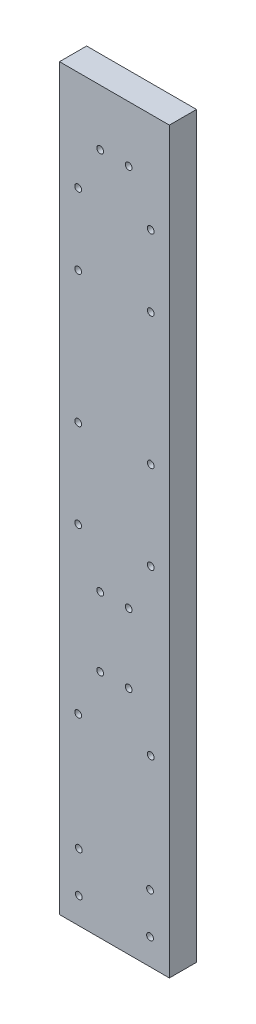
ISO-10303-21;
HEADER;
FILE_DESCRIPTION(('STEP AP214'),'2;1');
FILE_NAME('part.step','',(''),(''),'','','');
FILE_SCHEMA(('AUTOMOTIVE_DESIGN { 1 0 10303 214 1 1 1 1 }'));
ENDSEC;
DATA;
#1=APPLICATION_CONTEXT('core data for automotive mechanical design processes');
#2=APPLICATION_PROTOCOL_DEFINITION('international standard','automotive_design',2000,#1);
#3=PRODUCT_CONTEXT('',#1,'mechanical');
#4=PRODUCT('Part','Part','',(#3));
#5=PRODUCT_RELATED_PRODUCT_CATEGORY('part','',(#4));
#6=PRODUCT_DEFINITION_FORMATION('','',#4);
#7=PRODUCT_DEFINITION_CONTEXT('part definition',#1,'design');
#8=PRODUCT_DEFINITION('design','',#6,#7);
#9=PRODUCT_DEFINITION_SHAPE('','',#8);
#10=(LENGTH_UNIT() NAMED_UNIT(*) SI_UNIT(.MILLI.,.METRE.));
#11=(NAMED_UNIT(*) PLANE_ANGLE_UNIT() SI_UNIT($,.RADIAN.));
#12=(NAMED_UNIT(*) SI_UNIT($,.STERADIAN.) SOLID_ANGLE_UNIT());
#13=UNCERTAINTY_MEASURE_WITH_UNIT(LENGTH_MEASURE(1.E-05),#10,'distance_accuracy_value','');
#14=(GEOMETRIC_REPRESENTATION_CONTEXT(3) GLOBAL_UNCERTAINTY_ASSIGNED_CONTEXT((#13)) GLOBAL_UNIT_ASSIGNED_CONTEXT((#10,
#11,#12)) REPRESENTATION_CONTEXT('',''));
#15=CARTESIAN_POINT('',(0.,0.,0.));
#16=DIRECTION('',(0.,0.,1.));
#17=DIRECTION('',(1.,0.,0.));
#18=AXIS2_PLACEMENT_3D('',#15,#16,#17);
#19=CARTESIAN_POINT('',(0.,0.,4.));
#20=DIRECTION('',(0.,0.,1.));
#21=DIRECTION('',(1.,0.,0.));
#22=AXIS2_PLACEMENT_3D('',#19,#20,#21);
#23=PLANE('',#22);
#24=CARTESIAN_POINT('',(13.350000000001,9.8464488310554,4.));
#25=DIRECTION('',(0.,0.,1.));
#26=DIRECTION('',(-1.,0.,0.));
#27=AXIS2_PLACEMENT_3D('',#24,#25,#26);
#28=CIRCLE('',#27,0.499999999999999);
#29=CARTESIAN_POINT('',(12.850000000001,9.8464488310554,4.));
#30=VERTEX_POINT('',#29);
#31=EDGE_CURVE('E216',#30,#30,#28,.T.);
#32=ORIENTED_EDGE('',*,*,#31,.F.);
#33=EDGE_LOOP('',(#32));
#34=FACE_BOUND('',#33,.T.);
#35=CARTESIAN_POINT('',(2.85000000000001,9.8464488310554,4.));
#36=DIRECTION('',(0.,0.,1.));
#37=DIRECTION('',(1.,0.,0.));
#38=AXIS2_PLACEMENT_3D('',#35,#36,#37);
#39=CIRCLE('',#38,0.499999999999999);
#40=CARTESIAN_POINT('',(3.35,9.8464488310554,4.));
#41=VERTEX_POINT('',#40);
#42=EDGE_CURVE('E204',#41,#41,#39,.T.);
#43=ORIENTED_EDGE('',*,*,#42,.F.);
#44=EDGE_LOOP('',(#43));
#45=FACE_BOUND('',#44,.T.);
#46=CARTESIAN_POINT('',(13.4500000000022,94.1599999999975,4.));
#47=DIRECTION('',(0.,0.,1.));
#48=DIRECTION('',(1.,0.,0.));
#49=AXIS2_PLACEMENT_3D('',#46,#47,#48);
#50=CIRCLE('',#49,0.499999999999999);
#51=CARTESIAN_POINT('',(13.9500000000022,94.1599999999975,4.));
#52=VERTEX_POINT('',#51);
#53=EDGE_CURVE('E192',#52,#52,#50,.T.);
#54=ORIENTED_EDGE('',*,*,#53,.F.);
#55=EDGE_LOOP('',(#54));
#56=FACE_BOUND('',#55,.T.);
#57=CARTESIAN_POINT('',(13.4500000000001,83.6599999999992,4.));
#58=DIRECTION('',(0.,0.,1.));
#59=DIRECTION('',(1.,0.,0.));
#60=AXIS2_PLACEMENT_3D('',#57,#58,#59);
#61=CIRCLE('',#60,0.499999999999999);
#62=CARTESIAN_POINT('',(13.9500000000001,83.6599999999992,4.));
#63=VERTEX_POINT('',#62);
#64=EDGE_CURVE('E180',#63,#63,#61,.T.);
#65=ORIENTED_EDGE('',*,*,#64,.F.);
#66=EDGE_LOOP('',(#65));
#67=FACE_BOUND('',#66,.T.);
#68=CARTESIAN_POINT('',(13.4500000000017,64.209999999999,4.));
#69=DIRECTION('',(0.,0.,1.));
#70=DIRECTION('',(1.,0.,0.));
#71=AXIS2_PLACEMENT_3D('',#68,#69,#70);
#72=CIRCLE('',#71,0.499999999999999);
#73=CARTESIAN_POINT('',(13.9500000000017,64.209999999999,4.));
#74=VERTEX_POINT('',#73);
#75=EDGE_CURVE('E168',#74,#74,#72,.T.);
#76=ORIENTED_EDGE('',*,*,#75,.F.);
#77=EDGE_LOOP('',(#76));
#78=FACE_BOUND('',#77,.T.);
#79=CARTESIAN_POINT('',(13.4500000000001,51.2099999999992,4.));
#80=DIRECTION('',(0.,0.,1.));
#81=DIRECTION('',(1.,0.,0.));
#82=AXIS2_PLACEMENT_3D('',#79,#80,#81);
#83=CIRCLE('',#82,0.499999999999999);
#84=CARTESIAN_POINT('',(13.9500000000001,51.2099999999992,4.));
#85=VERTEX_POINT('',#84);
#86=EDGE_CURVE('E156',#85,#85,#83,.T.);
#87=ORIENTED_EDGE('',*,*,#86,.F.);
#88=EDGE_LOOP('',(#87));
#89=FACE_BOUND('',#88,.T.);
#90=CARTESIAN_POINT('',(13.4500000000001,27.0000000000002,4.));
#91=DIRECTION('',(0.,0.,1.));
#92=DIRECTION('',(1.,0.,0.));
#93=AXIS2_PLACEMENT_3D('',#90,#91,#92);
#94=CIRCLE('',#93,0.499999999999999);
#95=CARTESIAN_POINT('',(13.9500000000001,27.0000000000002,4.));
#96=VERTEX_POINT('',#95);
#97=EDGE_CURVE('E144',#96,#96,#94,.T.);
#98=ORIENTED_EDGE('',*,*,#97,.F.);
#99=EDGE_LOOP('',(#98));
#100=FACE_BOUND('',#99,.T.);
#101=CARTESIAN_POINT('',(10.2000000000001,33.9999999999999,4.));
#102=DIRECTION('',(0.,0.,1.));
#103=DIRECTION('',(1.,0.,0.));
#104=AXIS2_PLACEMENT_3D('',#101,#102,#103);
#105=CIRCLE('',#104,0.499999999999999);
#106=CARTESIAN_POINT('',(10.7000000000001,33.9999999999999,4.));
#107=VERTEX_POINT('',#106);
#108=EDGE_CURVE('E132',#107,#107,#105,.T.);
#109=ORIENTED_EDGE('',*,*,#108,.F.);
#110=EDGE_LOOP('',(#109));
#111=FACE_BOUND('',#110,.T.);
#112=CARTESIAN_POINT('',(10.2000000000001,44.2099999999995,4.));
#113=DIRECTION('',(0.,0.,1.));
#114=DIRECTION('',(1.,0.,0.));
#115=AXIS2_PLACEMENT_3D('',#112,#113,#114);
#116=CIRCLE('',#115,0.499999999999999);
#117=CARTESIAN_POINT('',(10.7000000000001,44.2099999999995,4.));
#118=VERTEX_POINT('',#117);
#119=EDGE_CURVE('E120',#118,#118,#116,.T.);
#120=ORIENTED_EDGE('',*,*,#119,.F.);
#121=EDGE_LOOP('',(#120));
#122=FACE_BOUND('',#121,.T.);
#123=CARTESIAN_POINT('',(10.2000000000012,100.660000000002,4.));
#124=DIRECTION('',(0.,0.,1.));
#125=DIRECTION('',(1.,0.,0.));
#126=AXIS2_PLACEMENT_3D('',#123,#124,#125);
#127=CIRCLE('',#126,0.499999999999999);
#128=CARTESIAN_POINT('',(10.7000000000012,100.660000000002,4.));
#129=VERTEX_POINT('',#128);
#130=EDGE_CURVE('E99',#129,#129,#127,.T.);
#131=ORIENTED_EDGE('',*,*,#130,.F.);
#132=EDGE_LOOP('',(#131));
#133=FACE_BOUND('',#132,.T.);
#134=DIRECTION('',(0.,-1.,0.));
#135=VECTOR('',#134,1.);
#136=CARTESIAN_POINT('',(0.,108.909999999999,4.));
#137=LINE('',#136,#135);
#138=CARTESIAN_POINT('',(0.,108.909999999999,4.));
#139=VERTEX_POINT('',#138);
#140=CARTESIAN_POINT('',(0.,0.,4.));
#141=VERTEX_POINT('',#140);
#142=EDGE_CURVE('E84',#139,#141,#137,.T.);
#143=ORIENTED_EDGE('',*,*,#142,.T.);
#144=DIRECTION('',(1.,0.,0.));
#145=VECTOR('',#144,1.);
#146=CARTESIAN_POINT('',(0.,0.,4.));
#147=LINE('',#146,#145);
#148=CARTESIAN_POINT('',(16.2,0.,4.));
#149=VERTEX_POINT('',#148);
#150=EDGE_CURVE('E79',#141,#149,#147,.T.);
#151=ORIENTED_EDGE('',*,*,#150,.T.);
#152=DIRECTION('',(0.,1.,0.));
#153=VECTOR('',#152,1.);
#154=CARTESIAN_POINT('',(16.2,0.,4.));
#155=LINE('',#154,#153);
#156=CARTESIAN_POINT('',(16.2,108.909999999999,4.));
#157=VERTEX_POINT('',#156);
#158=EDGE_CURVE('E82',#149,#157,#155,.T.);
#159=ORIENTED_EDGE('',*,*,#158,.T.);
#160=DIRECTION('',(-1.,0.,0.));
#161=VECTOR('',#160,1.);
#162=CARTESIAN_POINT('',(16.2,108.909999999999,4.));
#163=LINE('',#162,#161);
#164=EDGE_CURVE('E49',#157,#139,#163,.T.);
#165=ORIENTED_EDGE('',*,*,#164,.T.);
#166=EDGE_LOOP('',(#143,#151,#159,#165));
#167=FACE_BOUND('',#166,.T.);
#168=CARTESIAN_POINT('',(6.00000000000112,100.660000000002,4.));
#169=DIRECTION('',(0.,0.,1.));
#170=DIRECTION('',(1.,0.,0.));
#171=AXIS2_PLACEMENT_3D('',#168,#169,#170);
#172=CIRCLE('',#171,0.499999999999999);
#173=CARTESIAN_POINT('',(6.50000000000111,100.660000000002,4.));
#174=VERTEX_POINT('',#173);
#175=EDGE_CURVE('E114',#174,#174,#172,.T.);
#176=ORIENTED_EDGE('',*,*,#175,.F.);
#177=EDGE_LOOP('',(#176));
#178=FACE_BOUND('',#177,.T.);
#179=CARTESIAN_POINT('',(6.00000000000001,44.2099999999995,4.));
#180=DIRECTION('',(0.,0.,1.));
#181=DIRECTION('',(1.,0.,0.));
#182=AXIS2_PLACEMENT_3D('',#179,#180,#181);
#183=CIRCLE('',#182,0.499999999999999);
#184=CARTESIAN_POINT('',(6.5,44.2099999999995,4.));
#185=VERTEX_POINT('',#184);
#186=EDGE_CURVE('E126',#185,#185,#183,.T.);
#187=ORIENTED_EDGE('',*,*,#186,.F.);
#188=EDGE_LOOP('',(#187));
#189=FACE_BOUND('',#188,.T.);
#190=CARTESIAN_POINT('',(6.00000000000001,33.9999999999999,4.));
#191=DIRECTION('',(0.,0.,1.));
#192=DIRECTION('',(1.,0.,0.));
#193=AXIS2_PLACEMENT_3D('',#190,#191,#192);
#194=CIRCLE('',#193,0.500000000000012);
#195=CARTESIAN_POINT('',(6.50000000000002,33.9999999999999,4.));
#196=VERTEX_POINT('',#195);
#197=EDGE_CURVE('E138',#196,#196,#194,.T.);
#198=ORIENTED_EDGE('',*,*,#197,.F.);
#199=EDGE_LOOP('',(#198));
#200=FACE_BOUND('',#199,.T.);
#201=CARTESIAN_POINT('',(2.75000000000004,27.0000000000004,4.));
#202=DIRECTION('',(0.,0.,1.));
#203=DIRECTION('',(1.,0.,0.));
#204=AXIS2_PLACEMENT_3D('',#201,#202,#203);
#205=CIRCLE('',#204,0.499999999999999);
#206=CARTESIAN_POINT('',(3.25000000000004,27.0000000000004,4.));
#207=VERTEX_POINT('',#206);
#208=EDGE_CURVE('E150',#207,#207,#205,.T.);
#209=ORIENTED_EDGE('',*,*,#208,.F.);
#210=EDGE_LOOP('',(#209));
#211=FACE_BOUND('',#210,.T.);
#212=CARTESIAN_POINT('',(2.75000000000003,51.2099999999994,4.));
#213=DIRECTION('',(0.,0.,1.));
#214=DIRECTION('',(1.,0.,0.));
#215=AXIS2_PLACEMENT_3D('',#212,#213,#214);
#216=CIRCLE('',#215,0.499999999999999);
#217=CARTESIAN_POINT('',(3.25000000000003,51.2099999999994,4.));
#218=VERTEX_POINT('',#217);
#219=EDGE_CURVE('E162',#218,#218,#216,.T.);
#220=ORIENTED_EDGE('',*,*,#219,.F.);
#221=EDGE_LOOP('',(#220));
#222=FACE_BOUND('',#221,.T.);
#223=CARTESIAN_POINT('',(2.75000000000138,64.2099999999993,4.));
#224=DIRECTION('',(0.,0.,1.));
#225=DIRECTION('',(1.,0.,0.));
#226=AXIS2_PLACEMENT_3D('',#223,#224,#225);
#227=CIRCLE('',#226,0.499999999999999);
#228=CARTESIAN_POINT('',(3.25000000000138,64.2099999999993,4.));
#229=VERTEX_POINT('',#228);
#230=EDGE_CURVE('E174',#229,#229,#227,.T.);
#231=ORIENTED_EDGE('',*,*,#230,.F.);
#232=EDGE_LOOP('',(#231));
#233=FACE_BOUND('',#232,.T.);
#234=CARTESIAN_POINT('',(2.75000000000004,83.6599999999994,4.));
#235=DIRECTION('',(0.,0.,1.));
#236=DIRECTION('',(1.,0.,0.));
#237=AXIS2_PLACEMENT_3D('',#234,#235,#236);
#238=CIRCLE('',#237,0.499999999999999);
#239=CARTESIAN_POINT('',(3.25000000000004,83.6599999999994,4.));
#240=VERTEX_POINT('',#239);
#241=EDGE_CURVE('E186',#240,#240,#238,.T.);
#242=ORIENTED_EDGE('',*,*,#241,.F.);
#243=EDGE_LOOP('',(#242));
#244=FACE_BOUND('',#243,.T.);
#245=CARTESIAN_POINT('',(2.75000000000093,94.1599999999998,4.));
#246=DIRECTION('',(0.,0.,1.));
#247=DIRECTION('',(1.,0.,0.));
#248=AXIS2_PLACEMENT_3D('',#245,#246,#247);
#249=CIRCLE('',#248,0.499999999999999);
#250=CARTESIAN_POINT('',(3.25000000000093,94.1599999999998,4.));
#251=VERTEX_POINT('',#250);
#252=EDGE_CURVE('E198',#251,#251,#249,.T.);
#253=ORIENTED_EDGE('',*,*,#252,.F.);
#254=EDGE_LOOP('',(#253));
#255=FACE_BOUND('',#254,.T.);
#256=CARTESIAN_POINT('',(2.85000000000001,3.84644883105539,4.));
#257=DIRECTION('',(0.,0.,1.));
#258=DIRECTION('',(1.,0.,0.));
#259=AXIS2_PLACEMENT_3D('',#256,#257,#258);
#260=CIRCLE('',#259,0.499999999999999);
#261=CARTESIAN_POINT('',(3.35,3.84644883105539,4.));
#262=VERTEX_POINT('',#261);
#263=EDGE_CURVE('E210',#262,#262,#260,.T.);
#264=ORIENTED_EDGE('',*,*,#263,.F.);
#265=EDGE_LOOP('',(#264));
#266=FACE_BOUND('',#265,.T.);
#267=CARTESIAN_POINT('',(13.350000000001,3.84644883105539,4.));
#268=DIRECTION('',(0.,0.,1.));
#269=DIRECTION('',(-1.,0.,0.));
#270=AXIS2_PLACEMENT_3D('',#267,#268,#269);
#271=CIRCLE('',#270,0.499999999999999);
#272=CARTESIAN_POINT('',(12.850000000001,3.84644883105539,4.));
#273=VERTEX_POINT('',#272);
#274=EDGE_CURVE('E222',#273,#273,#271,.T.);
#275=ORIENTED_EDGE('',*,*,#274,.F.);
#276=EDGE_LOOP('',(#275));
#277=FACE_BOUND('',#276,.T.);
#278=ADVANCED_FACE('F32',(#34,#45,#56,#67,#78,#89,#100,#111,#122,#133,#167,#178,#189,#200,#211,
#222,#233,#244,#255,#266,#277),#23,.T.);
#279=CARTESIAN_POINT('',(0.,0.,0.));
#280=DIRECTION('',(0.,0.,1.));
#281=DIRECTION('',(1.,0.,0.));
#282=AXIS2_PLACEMENT_3D('',#279,#280,#281);
#283=PLANE('',#282);
#284=CARTESIAN_POINT('',(13.350000000001,9.8464488310554,0.));
#285=DIRECTION('',(0.,0.,1.));
#286=DIRECTION('',(-1.,0.,0.));
#287=AXIS2_PLACEMENT_3D('',#284,#285,#286);
#288=CIRCLE('',#287,0.499999999999999);
#289=CARTESIAN_POINT('',(12.850000000001,9.8464488310554,0.));
#290=VERTEX_POINT('',#289);
#291=EDGE_CURVE('E219',#290,#290,#288,.T.);
#292=ORIENTED_EDGE('',*,*,#291,.T.);
#293=EDGE_LOOP('',(#292));
#294=FACE_BOUND('',#293,.T.);
#295=CARTESIAN_POINT('',(2.85000000000001,9.8464488310554,0.));
#296=DIRECTION('',(0.,0.,1.));
#297=DIRECTION('',(1.,0.,0.));
#298=AXIS2_PLACEMENT_3D('',#295,#296,#297);
#299=CIRCLE('',#298,0.499999999999999);
#300=CARTESIAN_POINT('',(3.35,9.8464488310554,0.));
#301=VERTEX_POINT('',#300);
#302=EDGE_CURVE('E207',#301,#301,#299,.T.);
#303=ORIENTED_EDGE('',*,*,#302,.T.);
#304=EDGE_LOOP('',(#303));
#305=FACE_BOUND('',#304,.T.);
#306=CARTESIAN_POINT('',(13.4500000000022,94.1599999999975,0.));
#307=DIRECTION('',(0.,0.,1.));
#308=DIRECTION('',(1.,0.,0.));
#309=AXIS2_PLACEMENT_3D('',#306,#307,#308);
#310=CIRCLE('',#309,0.499999999999999);
#311=CARTESIAN_POINT('',(13.9500000000022,94.1599999999975,0.));
#312=VERTEX_POINT('',#311);
#313=EDGE_CURVE('E195',#312,#312,#310,.T.);
#314=ORIENTED_EDGE('',*,*,#313,.T.);
#315=EDGE_LOOP('',(#314));
#316=FACE_BOUND('',#315,.T.);
#317=CARTESIAN_POINT('',(13.4500000000001,83.6599999999992,0.));
#318=DIRECTION('',(0.,0.,1.));
#319=DIRECTION('',(1.,0.,0.));
#320=AXIS2_PLACEMENT_3D('',#317,#318,#319);
#321=CIRCLE('',#320,0.499999999999999);
#322=CARTESIAN_POINT('',(13.9500000000001,83.6599999999992,0.));
#323=VERTEX_POINT('',#322);
#324=EDGE_CURVE('E183',#323,#323,#321,.T.);
#325=ORIENTED_EDGE('',*,*,#324,.T.);
#326=EDGE_LOOP('',(#325));
#327=FACE_BOUND('',#326,.T.);
#328=CARTESIAN_POINT('',(13.4500000000017,64.209999999999,0.));
#329=DIRECTION('',(0.,0.,1.));
#330=DIRECTION('',(1.,0.,0.));
#331=AXIS2_PLACEMENT_3D('',#328,#329,#330);
#332=CIRCLE('',#331,0.499999999999999);
#333=CARTESIAN_POINT('',(13.9500000000017,64.209999999999,0.));
#334=VERTEX_POINT('',#333);
#335=EDGE_CURVE('E171',#334,#334,#332,.T.);
#336=ORIENTED_EDGE('',*,*,#335,.T.);
#337=EDGE_LOOP('',(#336));
#338=FACE_BOUND('',#337,.T.);
#339=CARTESIAN_POINT('',(13.4500000000001,51.2099999999992,0.));
#340=DIRECTION('',(0.,0.,1.));
#341=DIRECTION('',(1.,0.,0.));
#342=AXIS2_PLACEMENT_3D('',#339,#340,#341);
#343=CIRCLE('',#342,0.499999999999999);
#344=CARTESIAN_POINT('',(13.9500000000001,51.2099999999992,0.));
#345=VERTEX_POINT('',#344);
#346=EDGE_CURVE('E159',#345,#345,#343,.T.);
#347=ORIENTED_EDGE('',*,*,#346,.T.);
#348=EDGE_LOOP('',(#347));
#349=FACE_BOUND('',#348,.T.);
#350=CARTESIAN_POINT('',(13.4500000000001,27.0000000000002,0.));
#351=DIRECTION('',(0.,0.,1.));
#352=DIRECTION('',(1.,0.,0.));
#353=AXIS2_PLACEMENT_3D('',#350,#351,#352);
#354=CIRCLE('',#353,0.499999999999999);
#355=CARTESIAN_POINT('',(13.9500000000001,27.0000000000002,0.));
#356=VERTEX_POINT('',#355);
#357=EDGE_CURVE('E147',#356,#356,#354,.T.);
#358=ORIENTED_EDGE('',*,*,#357,.T.);
#359=EDGE_LOOP('',(#358));
#360=FACE_BOUND('',#359,.T.);
#361=CARTESIAN_POINT('',(10.2000000000001,33.9999999999999,0.));
#362=DIRECTION('',(0.,0.,1.));
#363=DIRECTION('',(1.,0.,0.));
#364=AXIS2_PLACEMENT_3D('',#361,#362,#363);
#365=CIRCLE('',#364,0.499999999999999);
#366=CARTESIAN_POINT('',(10.7000000000001,33.9999999999999,0.));
#367=VERTEX_POINT('',#366);
#368=EDGE_CURVE('E135',#367,#367,#365,.T.);
#369=ORIENTED_EDGE('',*,*,#368,.T.);
#370=EDGE_LOOP('',(#369));
#371=FACE_BOUND('',#370,.T.);
#372=CARTESIAN_POINT('',(10.2000000000001,44.2099999999995,0.));
#373=DIRECTION('',(0.,0.,1.));
#374=DIRECTION('',(1.,0.,0.));
#375=AXIS2_PLACEMENT_3D('',#372,#373,#374);
#376=CIRCLE('',#375,0.499999999999999);
#377=CARTESIAN_POINT('',(10.7000000000001,44.2099999999995,0.));
#378=VERTEX_POINT('',#377);
#379=EDGE_CURVE('E123',#378,#378,#376,.T.);
#380=ORIENTED_EDGE('',*,*,#379,.T.);
#381=EDGE_LOOP('',(#380));
#382=FACE_BOUND('',#381,.T.);
#383=CARTESIAN_POINT('',(10.2000000000012,100.660000000002,0.));
#384=DIRECTION('',(0.,0.,1.));
#385=DIRECTION('',(1.,0.,0.));
#386=AXIS2_PLACEMENT_3D('',#383,#384,#385);
#387=CIRCLE('',#386,0.499999999999999);
#388=CARTESIAN_POINT('',(10.7000000000012,100.660000000002,0.));
#389=VERTEX_POINT('',#388);
#390=EDGE_CURVE('E111',#389,#389,#387,.T.);
#391=ORIENTED_EDGE('',*,*,#390,.T.);
#392=EDGE_LOOP('',(#391));
#393=FACE_BOUND('',#392,.T.);
#394=DIRECTION('',(0.,-1.,0.));
#395=VECTOR('',#394,1.);
#396=CARTESIAN_POINT('',(0.,108.909999999999,0.));
#397=LINE('',#396,#395);
#398=CARTESIAN_POINT('',(0.,108.909999999999,0.));
#399=VERTEX_POINT('',#398);
#400=CARTESIAN_POINT('',(0.,0.,0.));
#401=VERTEX_POINT('',#400);
#402=EDGE_CURVE('E96',#399,#401,#397,.T.);
#403=ORIENTED_EDGE('',*,*,#402,.F.);
#404=DIRECTION('',(-1.,0.,0.));
#405=VECTOR('',#404,1.);
#406=CARTESIAN_POINT('',(16.2,108.909999999999,0.));
#407=LINE('',#406,#405);
#408=CARTESIAN_POINT('',(16.2,108.909999999999,0.));
#409=VERTEX_POINT('',#408);
#410=EDGE_CURVE('E72',#409,#399,#407,.T.);
#411=ORIENTED_EDGE('',*,*,#410,.F.);
#412=DIRECTION('',(0.,1.,0.));
#413=VECTOR('',#412,1.);
#414=CARTESIAN_POINT('',(16.2,0.,0.));
#415=LINE('',#414,#413);
#416=CARTESIAN_POINT('',(16.2,0.,0.));
#417=VERTEX_POINT('',#416);
#418=EDGE_CURVE('E66',#417,#409,#415,.T.);
#419=ORIENTED_EDGE('',*,*,#418,.F.);
#420=DIRECTION('',(1.,0.,0.));
#421=VECTOR('',#420,1.);
#422=CARTESIAN_POINT('',(0.,0.,0.));
#423=LINE('',#422,#421);
#424=EDGE_CURVE('E88',#401,#417,#423,.T.);
#425=ORIENTED_EDGE('',*,*,#424,.F.);
#426=EDGE_LOOP('',(#403,#411,#419,#425));
#427=FACE_BOUND('',#426,.T.);
#428=CARTESIAN_POINT('',(6.00000000000112,100.660000000002,0.));
#429=DIRECTION('',(0.,0.,1.));
#430=DIRECTION('',(1.,0.,0.));
#431=AXIS2_PLACEMENT_3D('',#428,#429,#430);
#432=CIRCLE('',#431,0.499999999999999);
#433=CARTESIAN_POINT('',(6.50000000000111,100.660000000002,0.));
#434=VERTEX_POINT('',#433);
#435=EDGE_CURVE('E117',#434,#434,#432,.T.);
#436=ORIENTED_EDGE('',*,*,#435,.T.);
#437=EDGE_LOOP('',(#436));
#438=FACE_BOUND('',#437,.T.);
#439=CARTESIAN_POINT('',(6.00000000000001,44.2099999999995,0.));
#440=DIRECTION('',(0.,0.,1.));
#441=DIRECTION('',(1.,0.,0.));
#442=AXIS2_PLACEMENT_3D('',#439,#440,#441);
#443=CIRCLE('',#442,0.499999999999999);
#444=CARTESIAN_POINT('',(6.5,44.2099999999995,0.));
#445=VERTEX_POINT('',#444);
#446=EDGE_CURVE('E129',#445,#445,#443,.T.);
#447=ORIENTED_EDGE('',*,*,#446,.T.);
#448=EDGE_LOOP('',(#447));
#449=FACE_BOUND('',#448,.T.);
#450=CARTESIAN_POINT('',(6.00000000000001,33.9999999999999,0.));
#451=DIRECTION('',(0.,0.,1.));
#452=DIRECTION('',(1.,0.,0.));
#453=AXIS2_PLACEMENT_3D('',#450,#451,#452);
#454=CIRCLE('',#453,0.500000000000012);
#455=CARTESIAN_POINT('',(6.50000000000002,33.9999999999999,0.));
#456=VERTEX_POINT('',#455);
#457=EDGE_CURVE('E141',#456,#456,#454,.T.);
#458=ORIENTED_EDGE('',*,*,#457,.T.);
#459=EDGE_LOOP('',(#458));
#460=FACE_BOUND('',#459,.T.);
#461=CARTESIAN_POINT('',(2.75000000000004,27.0000000000004,0.));
#462=DIRECTION('',(0.,0.,1.));
#463=DIRECTION('',(1.,0.,0.));
#464=AXIS2_PLACEMENT_3D('',#461,#462,#463);
#465=CIRCLE('',#464,0.499999999999999);
#466=CARTESIAN_POINT('',(3.25000000000004,27.0000000000004,0.));
#467=VERTEX_POINT('',#466);
#468=EDGE_CURVE('E153',#467,#467,#465,.T.);
#469=ORIENTED_EDGE('',*,*,#468,.T.);
#470=EDGE_LOOP('',(#469));
#471=FACE_BOUND('',#470,.T.);
#472=CARTESIAN_POINT('',(2.75000000000003,51.2099999999994,0.));
#473=DIRECTION('',(0.,0.,1.));
#474=DIRECTION('',(1.,0.,0.));
#475=AXIS2_PLACEMENT_3D('',#472,#473,#474);
#476=CIRCLE('',#475,0.499999999999999);
#477=CARTESIAN_POINT('',(3.25000000000003,51.2099999999994,0.));
#478=VERTEX_POINT('',#477);
#479=EDGE_CURVE('E165',#478,#478,#476,.T.);
#480=ORIENTED_EDGE('',*,*,#479,.T.);
#481=EDGE_LOOP('',(#480));
#482=FACE_BOUND('',#481,.T.);
#483=CARTESIAN_POINT('',(2.75000000000138,64.2099999999993,0.));
#484=DIRECTION('',(0.,0.,1.));
#485=DIRECTION('',(1.,0.,0.));
#486=AXIS2_PLACEMENT_3D('',#483,#484,#485);
#487=CIRCLE('',#486,0.499999999999999);
#488=CARTESIAN_POINT('',(3.25000000000138,64.2099999999993,0.));
#489=VERTEX_POINT('',#488);
#490=EDGE_CURVE('E177',#489,#489,#487,.T.);
#491=ORIENTED_EDGE('',*,*,#490,.T.);
#492=EDGE_LOOP('',(#491));
#493=FACE_BOUND('',#492,.T.);
#494=CARTESIAN_POINT('',(2.75000000000004,83.6599999999994,0.));
#495=DIRECTION('',(0.,0.,1.));
#496=DIRECTION('',(1.,0.,0.));
#497=AXIS2_PLACEMENT_3D('',#494,#495,#496);
#498=CIRCLE('',#497,0.499999999999999);
#499=CARTESIAN_POINT('',(3.25000000000004,83.6599999999994,0.));
#500=VERTEX_POINT('',#499);
#501=EDGE_CURVE('E189',#500,#500,#498,.T.);
#502=ORIENTED_EDGE('',*,*,#501,.T.);
#503=EDGE_LOOP('',(#502));
#504=FACE_BOUND('',#503,.T.);
#505=CARTESIAN_POINT('',(2.75000000000093,94.1599999999998,0.));
#506=DIRECTION('',(0.,0.,1.));
#507=DIRECTION('',(1.,0.,0.));
#508=AXIS2_PLACEMENT_3D('',#505,#506,#507);
#509=CIRCLE('',#508,0.499999999999999);
#510=CARTESIAN_POINT('',(3.25000000000093,94.1599999999998,0.));
#511=VERTEX_POINT('',#510);
#512=EDGE_CURVE('E201',#511,#511,#509,.T.);
#513=ORIENTED_EDGE('',*,*,#512,.T.);
#514=EDGE_LOOP('',(#513));
#515=FACE_BOUND('',#514,.T.);
#516=CARTESIAN_POINT('',(2.85000000000001,3.84644883105539,0.));
#517=DIRECTION('',(0.,0.,1.));
#518=DIRECTION('',(1.,0.,0.));
#519=AXIS2_PLACEMENT_3D('',#516,#517,#518);
#520=CIRCLE('',#519,0.499999999999999);
#521=CARTESIAN_POINT('',(3.35,3.84644883105539,0.));
#522=VERTEX_POINT('',#521);
#523=EDGE_CURVE('E213',#522,#522,#520,.T.);
#524=ORIENTED_EDGE('',*,*,#523,.T.);
#525=EDGE_LOOP('',(#524));
#526=FACE_BOUND('',#525,.T.);
#527=CARTESIAN_POINT('',(13.350000000001,3.84644883105539,0.));
#528=DIRECTION('',(0.,0.,1.));
#529=DIRECTION('',(-1.,0.,0.));
#530=AXIS2_PLACEMENT_3D('',#527,#528,#529);
#531=CIRCLE('',#530,0.499999999999999);
#532=CARTESIAN_POINT('',(12.850000000001,3.84644883105539,0.));
#533=VERTEX_POINT('',#532);
#534=EDGE_CURVE('E225',#533,#533,#531,.T.);
#535=ORIENTED_EDGE('',*,*,#534,.T.);
#536=EDGE_LOOP('',(#535));
#537=FACE_BOUND('',#536,.T.);
#538=ADVANCED_FACE('F107',(#294,#305,#316,#327,#338,#349,#360,#371,#382,#393,#427,#438,#449,
#460,#471,#482,#493,#504,#515,#526,#537),#283,.F.);
#539=CARTESIAN_POINT('',(0.,108.909999999999,4.));
#540=DIRECTION('',(1.,0.,0.));
#541=DIRECTION('',(0.,0.,-1.));
#542=AXIS2_PLACEMENT_3D('',#539,#540,#541);
#543=PLANE('',#542);
#544=ORIENTED_EDGE('',*,*,#402,.T.);
#545=DIRECTION('',(0.,0.,-1.));
#546=VECTOR('',#545,1.);
#547=CARTESIAN_POINT('',(0.,0.,4.));
#548=LINE('',#547,#546);
#549=EDGE_CURVE('E11',#141,#401,#548,.T.);
#550=ORIENTED_EDGE('',*,*,#549,.F.);
#551=ORIENTED_EDGE('',*,*,#142,.F.);
#552=DIRECTION('',(0.,0.,-1.));
#553=VECTOR('',#552,1.);
#554=CARTESIAN_POINT('',(0.,108.909999999999,4.));
#555=LINE('',#554,#553);
#556=EDGE_CURVE('E92',#139,#399,#555,.T.);
#557=ORIENTED_EDGE('',*,*,#556,.T.);
#558=EDGE_LOOP('',(#544,#550,#551,#557));
#559=FACE_BOUND('',#558,.T.);
#560=ADVANCED_FACE('F34',(#559),#543,.F.);
#561=CARTESIAN_POINT('',(0.,0.,4.));
#562=DIRECTION('',(0.,1.,0.));
#563=DIRECTION('',(0.,0.,1.));
#564=AXIS2_PLACEMENT_3D('',#561,#562,#563);
#565=PLANE('',#564);
#566=ORIENTED_EDGE('',*,*,#424,.T.);
#567=DIRECTION('',(0.,0.,-1.));
#568=VECTOR('',#567,1.);
#569=CARTESIAN_POINT('',(16.2,0.,4.));
#570=LINE('',#569,#568);
#571=EDGE_CURVE('E41',#149,#417,#570,.T.);
#572=ORIENTED_EDGE('',*,*,#571,.F.);
#573=ORIENTED_EDGE('',*,*,#150,.F.);
#574=ORIENTED_EDGE('',*,*,#549,.T.);
#575=EDGE_LOOP('',(#566,#572,#573,#574));
#576=FACE_BOUND('',#575,.T.);
#577=ADVANCED_FACE('F87',(#576),#565,.F.);
#578=CARTESIAN_POINT('',(16.2,0.,4.));
#579=DIRECTION('',(-1.,0.,0.));
#580=DIRECTION('',(0.,0.,1.));
#581=AXIS2_PLACEMENT_3D('',#578,#579,#580);
#582=PLANE('',#581);
#583=ORIENTED_EDGE('',*,*,#418,.T.);
#584=DIRECTION('',(0.,0.,-1.));
#585=VECTOR('',#584,1.);
#586=CARTESIAN_POINT('',(16.2,108.909999999999,4.));
#587=LINE('',#586,#585);
#588=EDGE_CURVE('E89',#157,#409,#587,.T.);
#589=ORIENTED_EDGE('',*,*,#588,.F.);
#590=ORIENTED_EDGE('',*,*,#158,.F.);
#591=ORIENTED_EDGE('',*,*,#571,.T.);
#592=EDGE_LOOP('',(#583,#589,#590,#591));
#593=FACE_BOUND('',#592,.T.);
#594=ADVANCED_FACE('F90',(#593),#582,.F.);
#595=CARTESIAN_POINT('',(16.2,108.909999999999,4.));
#596=DIRECTION('',(0.,-1.,0.));
#597=DIRECTION('',(0.,0.,-1.));
#598=AXIS2_PLACEMENT_3D('',#595,#596,#597);
#599=PLANE('',#598);
#600=ORIENTED_EDGE('',*,*,#410,.T.);
#601=ORIENTED_EDGE('',*,*,#556,.F.);
#602=ORIENTED_EDGE('',*,*,#164,.F.);
#603=ORIENTED_EDGE('',*,*,#588,.T.);
#604=EDGE_LOOP('',(#600,#601,#602,#603));
#605=FACE_BOUND('',#604,.T.);
#606=ADVANCED_FACE('F104',(#605),#599,.F.);
#607=CARTESIAN_POINT('',(10.2000000000012,100.660000000002,4.));
#608=DIRECTION('',(0.,0.,-1.));
#609=DIRECTION('',(-1.,0.,0.));
#610=AXIS2_PLACEMENT_3D('',#607,#608,#609);
#611=CYLINDRICAL_SURFACE('',#610,0.499999999999999);
#612=ORIENTED_EDGE('',*,*,#130,.T.);
#613=EDGE_LOOP('',(#612));
#614=FACE_BOUND('',#613,.T.);
#615=ORIENTED_EDGE('',*,*,#390,.F.);
#616=EDGE_LOOP('',(#615));
#617=FACE_BOUND('',#616,.T.);
#618=ADVANCED_FACE('F245',(#614,#617),#611,.F.);
#619=CARTESIAN_POINT('',(6.00000000000112,100.660000000002,4.));
#620=DIRECTION('',(0.,0.,-1.));
#621=DIRECTION('',(-1.,0.,0.));
#622=AXIS2_PLACEMENT_3D('',#619,#620,#621);
#623=CYLINDRICAL_SURFACE('',#622,0.499999999999999);
#624=ORIENTED_EDGE('',*,*,#175,.T.);
#625=EDGE_LOOP('',(#624));
#626=FACE_BOUND('',#625,.T.);
#627=ORIENTED_EDGE('',*,*,#435,.F.);
#628=EDGE_LOOP('',(#627));
#629=FACE_BOUND('',#628,.T.);
#630=ADVANCED_FACE('F291',(#626,#629),#623,.F.);
#631=CARTESIAN_POINT('',(10.2000000000001,44.2099999999995,4.));
#632=DIRECTION('',(0.,0.,-1.));
#633=DIRECTION('',(-1.,0.,0.));
#634=AXIS2_PLACEMENT_3D('',#631,#632,#633);
#635=CYLINDRICAL_SURFACE('',#634,0.499999999999999);
#636=ORIENTED_EDGE('',*,*,#119,.T.);
#637=EDGE_LOOP('',(#636));
#638=FACE_BOUND('',#637,.T.);
#639=ORIENTED_EDGE('',*,*,#379,.F.);
#640=EDGE_LOOP('',(#639));
#641=FACE_BOUND('',#640,.T.);
#642=ADVANCED_FACE('F299',(#638,#641),#635,.F.);
#643=CARTESIAN_POINT('',(6.00000000000001,44.2099999999995,4.));
#644=DIRECTION('',(0.,0.,-1.));
#645=DIRECTION('',(-1.,0.,0.));
#646=AXIS2_PLACEMENT_3D('',#643,#644,#645);
#647=CYLINDRICAL_SURFACE('',#646,0.499999999999999);
#648=ORIENTED_EDGE('',*,*,#186,.T.);
#649=EDGE_LOOP('',(#648));
#650=FACE_BOUND('',#649,.T.);
#651=ORIENTED_EDGE('',*,*,#446,.F.);
#652=EDGE_LOOP('',(#651));
#653=FACE_BOUND('',#652,.T.);
#654=ADVANCED_FACE('F307',(#650,#653),#647,.F.);
#655=CARTESIAN_POINT('',(10.2000000000001,33.9999999999999,4.));
#656=DIRECTION('',(0.,0.,-1.));
#657=DIRECTION('',(-1.,0.,0.));
#658=AXIS2_PLACEMENT_3D('',#655,#656,#657);
#659=CYLINDRICAL_SURFACE('',#658,0.499999999999999);
#660=ORIENTED_EDGE('',*,*,#108,.T.);
#661=EDGE_LOOP('',(#660));
#662=FACE_BOUND('',#661,.T.);
#663=ORIENTED_EDGE('',*,*,#368,.F.);
#664=EDGE_LOOP('',(#663));
#665=FACE_BOUND('',#664,.T.);
#666=ADVANCED_FACE('F316',(#662,#665),#659,.F.);
#667=CARTESIAN_POINT('',(6.00000000000001,33.9999999999999,4.));
#668=DIRECTION('',(0.,0.,-1.));
#669=DIRECTION('',(-1.,0.,0.));
#670=AXIS2_PLACEMENT_3D('',#667,#668,#669);
#671=CYLINDRICAL_SURFACE('',#670,0.500000000000012);
#672=ORIENTED_EDGE('',*,*,#197,.T.);
#673=EDGE_LOOP('',(#672));
#674=FACE_BOUND('',#673,.T.);
#675=ORIENTED_EDGE('',*,*,#457,.F.);
#676=EDGE_LOOP('',(#675));
#677=FACE_BOUND('',#676,.T.);
#678=ADVANCED_FACE('F325',(#674,#677),#671,.F.);
#679=CARTESIAN_POINT('',(13.4500000000001,27.0000000000002,4.));
#680=DIRECTION('',(0.,0.,-1.));
#681=DIRECTION('',(-1.,0.,0.));
#682=AXIS2_PLACEMENT_3D('',#679,#680,#681);
#683=CYLINDRICAL_SURFACE('',#682,0.499999999999999);
#684=ORIENTED_EDGE('',*,*,#97,.T.);
#685=EDGE_LOOP('',(#684));
#686=FACE_BOUND('',#685,.T.);
#687=ORIENTED_EDGE('',*,*,#357,.F.);
#688=EDGE_LOOP('',(#687));
#689=FACE_BOUND('',#688,.T.);
#690=ADVANCED_FACE('F334',(#686,#689),#683,.F.);
#691=CARTESIAN_POINT('',(2.75000000000004,27.0000000000004,4.));
#692=DIRECTION('',(0.,0.,-1.));
#693=DIRECTION('',(-1.,0.,0.));
#694=AXIS2_PLACEMENT_3D('',#691,#692,#693);
#695=CYLINDRICAL_SURFACE('',#694,0.499999999999999);
#696=ORIENTED_EDGE('',*,*,#208,.T.);
#697=EDGE_LOOP('',(#696));
#698=FACE_BOUND('',#697,.T.);
#699=ORIENTED_EDGE('',*,*,#468,.F.);
#700=EDGE_LOOP('',(#699));
#701=FACE_BOUND('',#700,.T.);
#702=ADVANCED_FACE('F343',(#698,#701),#695,.F.);
#703=CARTESIAN_POINT('',(13.4500000000001,51.2099999999992,4.));
#704=DIRECTION('',(0.,0.,-1.));
#705=DIRECTION('',(-1.,0.,0.));
#706=AXIS2_PLACEMENT_3D('',#703,#704,#705);
#707=CYLINDRICAL_SURFACE('',#706,0.499999999999999);
#708=ORIENTED_EDGE('',*,*,#86,.T.);
#709=EDGE_LOOP('',(#708));
#710=FACE_BOUND('',#709,.T.);
#711=ORIENTED_EDGE('',*,*,#346,.F.);
#712=EDGE_LOOP('',(#711));
#713=FACE_BOUND('',#712,.T.);
#714=ADVANCED_FACE('F352',(#710,#713),#707,.F.);
#715=CARTESIAN_POINT('',(2.75000000000003,51.2099999999994,4.));
#716=DIRECTION('',(0.,0.,-1.));
#717=DIRECTION('',(-1.,0.,0.));
#718=AXIS2_PLACEMENT_3D('',#715,#716,#717);
#719=CYLINDRICAL_SURFACE('',#718,0.499999999999999);
#720=ORIENTED_EDGE('',*,*,#219,.T.);
#721=EDGE_LOOP('',(#720));
#722=FACE_BOUND('',#721,.T.);
#723=ORIENTED_EDGE('',*,*,#479,.F.);
#724=EDGE_LOOP('',(#723));
#725=FACE_BOUND('',#724,.T.);
#726=ADVANCED_FACE('F361',(#722,#725),#719,.F.);
#727=CARTESIAN_POINT('',(13.4500000000017,64.209999999999,4.));
#728=DIRECTION('',(0.,0.,-1.));
#729=DIRECTION('',(-1.,0.,0.));
#730=AXIS2_PLACEMENT_3D('',#727,#728,#729);
#731=CYLINDRICAL_SURFACE('',#730,0.499999999999999);
#732=ORIENTED_EDGE('',*,*,#75,.T.);
#733=EDGE_LOOP('',(#732));
#734=FACE_BOUND('',#733,.T.);
#735=ORIENTED_EDGE('',*,*,#335,.F.);
#736=EDGE_LOOP('',(#735));
#737=FACE_BOUND('',#736,.T.);
#738=ADVANCED_FACE('F370',(#734,#737),#731,.F.);
#739=CARTESIAN_POINT('',(2.75000000000138,64.2099999999993,4.));
#740=DIRECTION('',(0.,0.,-1.));
#741=DIRECTION('',(-1.,0.,0.));
#742=AXIS2_PLACEMENT_3D('',#739,#740,#741);
#743=CYLINDRICAL_SURFACE('',#742,0.499999999999999);
#744=ORIENTED_EDGE('',*,*,#230,.T.);
#745=EDGE_LOOP('',(#744));
#746=FACE_BOUND('',#745,.T.);
#747=ORIENTED_EDGE('',*,*,#490,.F.);
#748=EDGE_LOOP('',(#747));
#749=FACE_BOUND('',#748,.T.);
#750=ADVANCED_FACE('F379',(#746,#749),#743,.F.);
#751=CARTESIAN_POINT('',(13.4500000000001,83.6599999999992,4.));
#752=DIRECTION('',(0.,0.,-1.));
#753=DIRECTION('',(-1.,0.,0.));
#754=AXIS2_PLACEMENT_3D('',#751,#752,#753);
#755=CYLINDRICAL_SURFACE('',#754,0.499999999999999);
#756=ORIENTED_EDGE('',*,*,#64,.T.);
#757=EDGE_LOOP('',(#756));
#758=FACE_BOUND('',#757,.T.);
#759=ORIENTED_EDGE('',*,*,#324,.F.);
#760=EDGE_LOOP('',(#759));
#761=FACE_BOUND('',#760,.T.);
#762=ADVANCED_FACE('F388',(#758,#761),#755,.F.);
#763=CARTESIAN_POINT('',(2.75000000000004,83.6599999999994,4.));
#764=DIRECTION('',(0.,0.,-1.));
#765=DIRECTION('',(-1.,0.,0.));
#766=AXIS2_PLACEMENT_3D('',#763,#764,#765);
#767=CYLINDRICAL_SURFACE('',#766,0.499999999999999);
#768=ORIENTED_EDGE('',*,*,#241,.T.);
#769=EDGE_LOOP('',(#768));
#770=FACE_BOUND('',#769,.T.);
#771=ORIENTED_EDGE('',*,*,#501,.F.);
#772=EDGE_LOOP('',(#771));
#773=FACE_BOUND('',#772,.T.);
#774=ADVANCED_FACE('F397',(#770,#773),#767,.F.);
#775=CARTESIAN_POINT('',(13.4500000000022,94.1599999999975,4.));
#776=DIRECTION('',(0.,0.,-1.));
#777=DIRECTION('',(-1.,0.,0.));
#778=AXIS2_PLACEMENT_3D('',#775,#776,#777);
#779=CYLINDRICAL_SURFACE('',#778,0.499999999999999);
#780=ORIENTED_EDGE('',*,*,#53,.T.);
#781=EDGE_LOOP('',(#780));
#782=FACE_BOUND('',#781,.T.);
#783=ORIENTED_EDGE('',*,*,#313,.F.);
#784=EDGE_LOOP('',(#783));
#785=FACE_BOUND('',#784,.T.);
#786=ADVANCED_FACE('F406',(#782,#785),#779,.F.);
#787=CARTESIAN_POINT('',(2.75000000000093,94.1599999999998,4.));
#788=DIRECTION('',(0.,0.,-1.));
#789=DIRECTION('',(-1.,0.,0.));
#790=AXIS2_PLACEMENT_3D('',#787,#788,#789);
#791=CYLINDRICAL_SURFACE('',#790,0.499999999999999);
#792=ORIENTED_EDGE('',*,*,#252,.T.);
#793=EDGE_LOOP('',(#792));
#794=FACE_BOUND('',#793,.T.);
#795=ORIENTED_EDGE('',*,*,#512,.F.);
#796=EDGE_LOOP('',(#795));
#797=FACE_BOUND('',#796,.T.);
#798=ADVANCED_FACE('F415',(#794,#797),#791,.F.);
#799=CARTESIAN_POINT('',(2.85000000000001,9.8464488310554,4.));
#800=DIRECTION('',(0.,0.,-1.));
#801=DIRECTION('',(-1.,0.,0.));
#802=AXIS2_PLACEMENT_3D('',#799,#800,#801);
#803=CYLINDRICAL_SURFACE('',#802,0.499999999999999);
#804=ORIENTED_EDGE('',*,*,#42,.T.);
#805=EDGE_LOOP('',(#804));
#806=FACE_BOUND('',#805,.T.);
#807=ORIENTED_EDGE('',*,*,#302,.F.);
#808=EDGE_LOOP('',(#807));
#809=FACE_BOUND('',#808,.T.);
#810=ADVANCED_FACE('F424',(#806,#809),#803,.F.);
#811=CARTESIAN_POINT('',(2.85000000000001,3.84644883105539,4.));
#812=DIRECTION('',(0.,0.,-1.));
#813=DIRECTION('',(-1.,0.,0.));
#814=AXIS2_PLACEMENT_3D('',#811,#812,#813);
#815=CYLINDRICAL_SURFACE('',#814,0.499999999999999);
#816=ORIENTED_EDGE('',*,*,#263,.T.);
#817=EDGE_LOOP('',(#816));
#818=FACE_BOUND('',#817,.T.);
#819=ORIENTED_EDGE('',*,*,#523,.F.);
#820=EDGE_LOOP('',(#819));
#821=FACE_BOUND('',#820,.T.);
#822=ADVANCED_FACE('F433',(#818,#821),#815,.F.);
#823=CARTESIAN_POINT('',(13.350000000001,9.8464488310554,4.));
#824=DIRECTION('',(0.,0.,-1.));
#825=DIRECTION('',(-1.,0.,0.));
#826=AXIS2_PLACEMENT_3D('',#823,#824,#825);
#827=CYLINDRICAL_SURFACE('',#826,0.499999999999999);
#828=ORIENTED_EDGE('',*,*,#31,.T.);
#829=EDGE_LOOP('',(#828));
#830=FACE_BOUND('',#829,.T.);
#831=ORIENTED_EDGE('',*,*,#291,.F.);
#832=EDGE_LOOP('',(#831));
#833=FACE_BOUND('',#832,.T.);
#834=ADVANCED_FACE('F442',(#830,#833),#827,.F.);
#835=CARTESIAN_POINT('',(13.350000000001,3.84644883105539,4.));
#836=DIRECTION('',(0.,0.,-1.));
#837=DIRECTION('',(-1.,0.,0.));
#838=AXIS2_PLACEMENT_3D('',#835,#836,#837);
#839=CYLINDRICAL_SURFACE('',#838,0.499999999999999);
#840=ORIENTED_EDGE('',*,*,#274,.T.);
#841=EDGE_LOOP('',(#840));
#842=FACE_BOUND('',#841,.T.);
#843=ORIENTED_EDGE('',*,*,#534,.F.);
#844=EDGE_LOOP('',(#843));
#845=FACE_BOUND('',#844,.T.);
#846=ADVANCED_FACE('F231',(#842,#845),#839,.F.);
#847=CLOSED_SHELL('',(#278,#538,#560,#577,#594,#606,#618,#630,#642,#654,#666,#678,#690,#702,
#714,#726,#738,#750,#762,#774,#786,#798,#810,#822,#834,#846));
#848=MANIFOLD_SOLID_BREP('B2',#847);
#849=ADVANCED_BREP_SHAPE_REPRESENTATION('',(#18,#848),#14);
#850=SHAPE_DEFINITION_REPRESENTATION(#9,#849);
ENDSEC;
END-ISO-10303-21;
